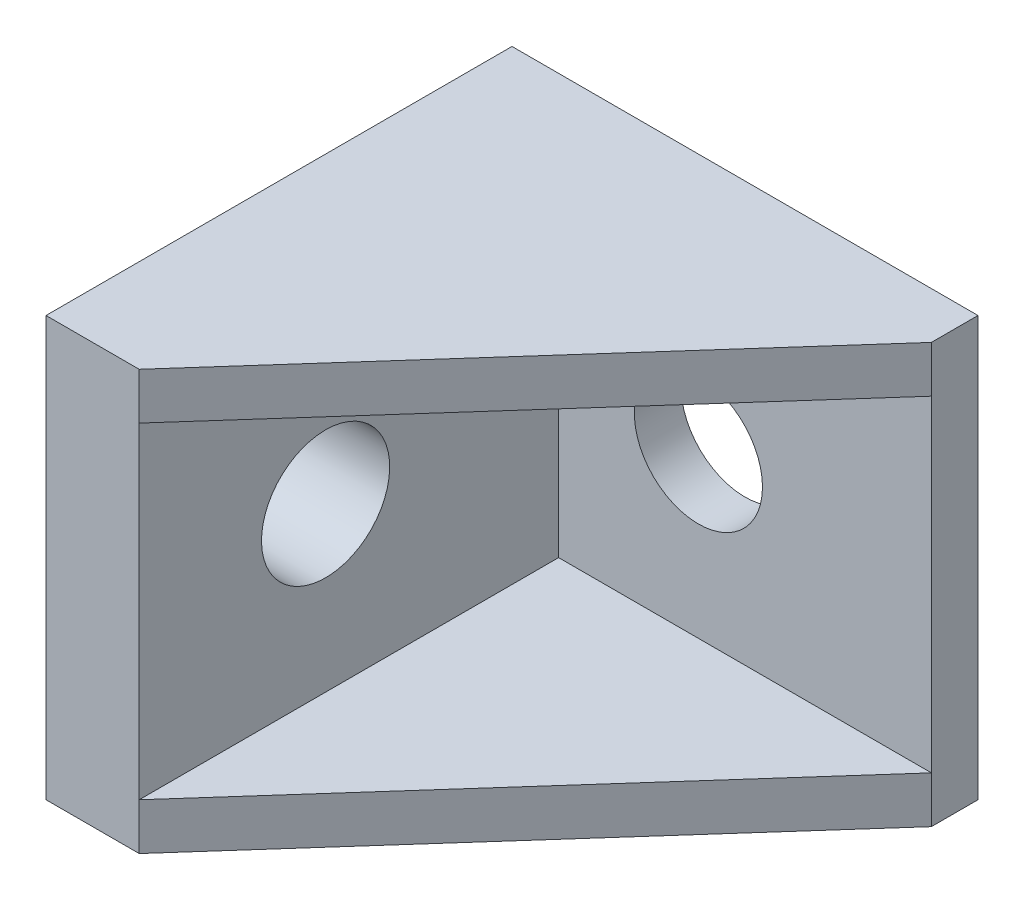
ISO-10303-21;
HEADER;
FILE_DESCRIPTION(('STEP AP214'),'2;1');
FILE_NAME('part.step','',(''),(''),'','','');
FILE_SCHEMA(('AUTOMOTIVE_DESIGN { 1 0 10303 214 1 1 1 1 }'));
ENDSEC;
DATA;
#1=APPLICATION_CONTEXT('core data for automotive mechanical design processes');
#2=APPLICATION_PROTOCOL_DEFINITION('international standard','automotive_design',2000,#1);
#3=PRODUCT_CONTEXT('',#1,'mechanical');
#4=PRODUCT('Part','Part','',(#3));
#5=PRODUCT_RELATED_PRODUCT_CATEGORY('part','',(#4));
#6=PRODUCT_DEFINITION_FORMATION('','',#4);
#7=PRODUCT_DEFINITION_CONTEXT('part definition',#1,'design');
#8=PRODUCT_DEFINITION('design','',#6,#7);
#9=PRODUCT_DEFINITION_SHAPE('','',#8);
#10=(LENGTH_UNIT() NAMED_UNIT(*) SI_UNIT(.MILLI.,.METRE.));
#11=(NAMED_UNIT(*) PLANE_ANGLE_UNIT() SI_UNIT($,.RADIAN.));
#12=(NAMED_UNIT(*) SI_UNIT($,.STERADIAN.) SOLID_ANGLE_UNIT());
#13=UNCERTAINTY_MEASURE_WITH_UNIT(LENGTH_MEASURE(1.E-05),#10,'distance_accuracy_value','');
#14=(GEOMETRIC_REPRESENTATION_CONTEXT(3) GLOBAL_UNCERTAINTY_ASSIGNED_CONTEXT((#13)) GLOBAL_UNIT_ASSIGNED_CONTEXT((#10,
#11,#12)) REPRESENTATION_CONTEXT('',''));
#15=CARTESIAN_POINT('',(0.,0.,0.));
#16=DIRECTION('',(0.,0.,1.));
#17=DIRECTION('',(1.,0.,0.));
#18=AXIS2_PLACEMENT_3D('',#15,#16,#17);
#19=CARTESIAN_POINT('',(10.,9.,20.));
#20=DIRECTION('',(-1.,0.,0.));
#21=DIRECTION('',(0.,0.,1.));
#22=AXIS2_PLACEMENT_3D('',#19,#20,#21);
#23=PLANE('',#22);
#24=DIRECTION('',(0.,0.,-1.));
#25=VECTOR('',#24,1.);
#26=CARTESIAN_POINT('',(10.,9.,20.));
#27=LINE('',#26,#25);
#28=CARTESIAN_POINT('',(10.,9.,2.));
#29=VERTEX_POINT('',#28);
#30=CARTESIAN_POINT('',(10.,9.,0.));
#31=VERTEX_POINT('',#30);
#32=EDGE_CURVE('E11',#29,#31,#27,.T.);
#33=ORIENTED_EDGE('',*,*,#32,.F.);
#34=DIRECTION('',(0.,1.,0.));
#35=VECTOR('',#34,1.);
#36=CARTESIAN_POINT('',(10.,-9.,2.));
#37=LINE('',#36,#35);
#38=CARTESIAN_POINT('',(10.,7.,2.));
#39=VERTEX_POINT('',#38);
#40=EDGE_CURVE('E138',#39,#29,#37,.T.);
#41=ORIENTED_EDGE('',*,*,#40,.F.);
#42=DIRECTION('',(0.,1.,0.));
#43=VECTOR('',#42,1.);
#44=CARTESIAN_POINT('',(10.,7.,2.));
#45=LINE('',#44,#43);
#46=CARTESIAN_POINT('',(10.,-7.,2.));
#47=VERTEX_POINT('',#46);
#48=EDGE_CURVE('E193',#47,#39,#45,.T.);
#49=ORIENTED_EDGE('',*,*,#48,.F.);
#50=CARTESIAN_POINT('',(10.,-9.,2.));
#51=VERTEX_POINT('',#50);
#52=EDGE_CURVE('E91',#51,#47,#37,.T.);
#53=ORIENTED_EDGE('',*,*,#52,.F.);
#54=DIRECTION('',(0.,0.,-1.));
#55=VECTOR('',#54,1.);
#56=CARTESIAN_POINT('',(10.,-9.,20.));
#57=LINE('',#56,#55);
#58=CARTESIAN_POINT('',(10.,-9.,0.));
#59=VERTEX_POINT('',#58);
#60=EDGE_CURVE('E83',#51,#59,#57,.T.);
#61=ORIENTED_EDGE('',*,*,#60,.T.);
#62=DIRECTION('',(0.,1.,0.));
#63=VECTOR('',#62,1.);
#64=CARTESIAN_POINT('',(10.,9.,0.));
#65=LINE('',#64,#63);
#66=EDGE_CURVE('E87',#59,#31,#65,.T.);
#67=ORIENTED_EDGE('',*,*,#66,.T.);
#68=EDGE_LOOP('',(#33,#41,#49,#53,#61,#67));
#69=FACE_BOUND('',#68,.T.);
#70=ADVANCED_FACE('F44',(#69),#23,.F.);
#71=CARTESIAN_POINT('',(-10.,9.,20.));
#72=DIRECTION('',(0.,-1.,0.));
#73=DIRECTION('',(0.,0.,-1.));
#74=AXIS2_PLACEMENT_3D('',#71,#72,#73);
#75=PLANE('',#74);
#76=DIRECTION('',(-1.,0.,0.));
#77=VECTOR('',#76,1.);
#78=CARTESIAN_POINT('',(-10.,9.,20.));
#79=LINE('',#78,#77);
#80=CARTESIAN_POINT('',(-6.,9.,20.));
#81=VERTEX_POINT('',#80);
#82=CARTESIAN_POINT('',(-10.,9.,20.));
#83=VERTEX_POINT('',#82);
#84=EDGE_CURVE('E104',#81,#83,#79,.T.);
#85=ORIENTED_EDGE('',*,*,#84,.F.);
#86=DIRECTION('',(-0.66436383882992,0.,0.74740931868366));
#87=VECTOR('',#86,1.);
#88=CARTESIAN_POINT('',(-6.,9.,20.));
#89=LINE('',#88,#87);
#90=EDGE_CURVE('E134',#29,#81,#89,.T.);
#91=ORIENTED_EDGE('',*,*,#90,.F.);
#92=ORIENTED_EDGE('',*,*,#32,.T.);
#93=DIRECTION('',(-1.,0.,0.));
#94=VECTOR('',#93,1.);
#95=CARTESIAN_POINT('',(-10.,9.,0.));
#96=LINE('',#95,#94);
#97=CARTESIAN_POINT('',(-10.,9.,0.));
#98=VERTEX_POINT('',#97);
#99=EDGE_CURVE('E108',#31,#98,#96,.T.);
#100=ORIENTED_EDGE('',*,*,#99,.T.);
#101=DIRECTION('',(0.,0.,-1.));
#102=VECTOR('',#101,1.);
#103=CARTESIAN_POINT('',(-10.,9.,20.));
#104=LINE('',#103,#102);
#105=EDGE_CURVE('E53',#83,#98,#104,.T.);
#106=ORIENTED_EDGE('',*,*,#105,.F.);
#107=EDGE_LOOP('',(#85,#91,#92,#100,#106));
#108=FACE_BOUND('',#107,.T.);
#109=ADVANCED_FACE('F129',(#108),#75,.F.);
#110=CARTESIAN_POINT('',(-10.,9.,20.));
#111=DIRECTION('',(1.,0.,0.));
#112=DIRECTION('',(0.,0.,-1.));
#113=AXIS2_PLACEMENT_3D('',#110,#111,#112);
#114=PLANE('',#113);
#115=CARTESIAN_POINT('',(-10.,0.,12.));
#116=DIRECTION('',(1.,0.,0.));
#117=DIRECTION('',(0.,1.,0.));
#118=AXIS2_PLACEMENT_3D('',#115,#116,#117);
#119=CIRCLE('',#118,2.75);
#120=CARTESIAN_POINT('',(-10.,2.75,12.));
#121=VERTEX_POINT('',#120);
#122=EDGE_CURVE('E272',#121,#121,#119,.T.);
#123=ORIENTED_EDGE('',*,*,#122,.T.);
#124=EDGE_LOOP('',(#123));
#125=FACE_BOUND('',#124,.T.);
#126=DIRECTION('',(0.,-1.,0.));
#127=VECTOR('',#126,1.);
#128=CARTESIAN_POINT('',(-10.,9.,0.));
#129=LINE('',#128,#127);
#130=CARTESIAN_POINT('',(-10.,-9.,0.));
#131=VERTEX_POINT('',#130);
#132=EDGE_CURVE('E76',#98,#131,#129,.T.);
#133=ORIENTED_EDGE('',*,*,#132,.T.);
#134=DIRECTION('',(0.,0.,-1.));
#135=VECTOR('',#134,1.);
#136=CARTESIAN_POINT('',(-10.,-9.,20.));
#137=LINE('',#136,#135);
#138=CARTESIAN_POINT('',(-10.,-9.,20.));
#139=VERTEX_POINT('',#138);
#140=EDGE_CURVE('E95',#139,#131,#137,.T.);
#141=ORIENTED_EDGE('',*,*,#140,.F.);
#142=DIRECTION('',(0.,-1.,0.));
#143=VECTOR('',#142,1.);
#144=CARTESIAN_POINT('',(-10.,9.,20.));
#145=LINE('',#144,#143);
#146=EDGE_CURVE('E61',#83,#139,#145,.T.);
#147=ORIENTED_EDGE('',*,*,#146,.F.);
#148=ORIENTED_EDGE('',*,*,#105,.T.);
#149=EDGE_LOOP('',(#133,#141,#147,#148));
#150=FACE_BOUND('',#149,.T.);
#151=ADVANCED_FACE('F126',(#125,#150),#114,.F.);
#152=CARTESIAN_POINT('',(-10.,-9.,20.));
#153=DIRECTION('',(0.,1.,0.));
#154=DIRECTION('',(0.,0.,1.));
#155=AXIS2_PLACEMENT_3D('',#152,#153,#154);
#156=PLANE('',#155);
#157=ORIENTED_EDGE('',*,*,#60,.F.);
#158=DIRECTION('',(-0.66436383882992,0.,0.74740931868366));
#159=VECTOR('',#158,1.);
#160=CARTESIAN_POINT('',(-6.,-9.,20.));
#161=LINE('',#160,#159);
#162=CARTESIAN_POINT('',(-6.,-9.,20.));
#163=VERTEX_POINT('',#162);
#164=EDGE_CURVE('E206',#51,#163,#161,.T.);
#165=ORIENTED_EDGE('',*,*,#164,.T.);
#166=DIRECTION('',(1.,0.,0.));
#167=VECTOR('',#166,1.);
#168=CARTESIAN_POINT('',(-10.,-9.,20.));
#169=LINE('',#168,#167);
#170=EDGE_CURVE('E96',#139,#163,#169,.T.);
#171=ORIENTED_EDGE('',*,*,#170,.F.);
#172=ORIENTED_EDGE('',*,*,#140,.T.);
#173=DIRECTION('',(1.,0.,0.));
#174=VECTOR('',#173,1.);
#175=CARTESIAN_POINT('',(-10.,-9.,0.));
#176=LINE('',#175,#174);
#177=EDGE_CURVE('E99',#131,#59,#176,.T.);
#178=ORIENTED_EDGE('',*,*,#177,.T.);
#179=EDGE_LOOP('',(#157,#165,#171,#172,#178));
#180=FACE_BOUND('',#179,.T.);
#181=ADVANCED_FACE('F100',(#180),#156,.F.);
#182=CARTESIAN_POINT('',(0.,0.,20.));
#183=DIRECTION('',(0.,0.,1.));
#184=DIRECTION('',(1.,0.,0.));
#185=AXIS2_PLACEMENT_3D('',#182,#183,#184);
#186=PLANE('',#185);
#187=DIRECTION('',(0.,1.,0.));
#188=VECTOR('',#187,1.);
#189=CARTESIAN_POINT('',(-6.,-9.,20.));
#190=LINE('',#189,#188);
#191=CARTESIAN_POINT('',(-6.,7.,20.));
#192=VERTEX_POINT('',#191);
#193=EDGE_CURVE('E163',#192,#81,#190,.T.);
#194=ORIENTED_EDGE('',*,*,#193,.T.);
#195=ORIENTED_EDGE('',*,*,#84,.T.);
#196=ORIENTED_EDGE('',*,*,#146,.T.);
#197=ORIENTED_EDGE('',*,*,#170,.T.);
#198=CARTESIAN_POINT('',(-6.,-7.,20.));
#199=VERTEX_POINT('',#198);
#200=EDGE_CURVE('E169',#163,#199,#190,.T.);
#201=ORIENTED_EDGE('',*,*,#200,.T.);
#202=DIRECTION('',(0.,-1.,0.));
#203=VECTOR('',#202,1.);
#204=CARTESIAN_POINT('',(-6.,7.,20.));
#205=LINE('',#204,#203);
#206=EDGE_CURVE('E184',#192,#199,#205,.T.);
#207=ORIENTED_EDGE('',*,*,#206,.F.);
#208=EDGE_LOOP('',(#194,#195,#196,#197,#201,#207));
#209=FACE_BOUND('',#208,.T.);
#210=ADVANCED_FACE('F191',(#209),#186,.T.);
#211=CARTESIAN_POINT('',(0.,0.,0.));
#212=DIRECTION('',(0.,0.,1.));
#213=DIRECTION('',(1.,0.,0.));
#214=AXIS2_PLACEMENT_3D('',#211,#212,#213);
#215=PLANE('',#214);
#216=CARTESIAN_POINT('',(0.,0.,0.));
#217=DIRECTION('',(0.,0.,1.));
#218=DIRECTION('',(1.,0.,0.));
#219=AXIS2_PLACEMENT_3D('',#216,#217,#218);
#220=CIRCLE('',#219,2.75);
#221=CARTESIAN_POINT('',(2.75,0.,0.));
#222=VERTEX_POINT('',#221);
#223=EDGE_CURVE('E213',#222,#222,#220,.T.);
#224=ORIENTED_EDGE('',*,*,#223,.T.);
#225=EDGE_LOOP('',(#224));
#226=FACE_BOUND('',#225,.T.);
#227=ORIENTED_EDGE('',*,*,#66,.F.);
#228=ORIENTED_EDGE('',*,*,#177,.F.);
#229=ORIENTED_EDGE('',*,*,#132,.F.);
#230=ORIENTED_EDGE('',*,*,#99,.F.);
#231=EDGE_LOOP('',(#227,#228,#229,#230));
#232=FACE_BOUND('',#231,.T.);
#233=ADVANCED_FACE('F107',(#226,#232),#215,.F.);
#234=CARTESIAN_POINT('',(10.,-7.,2.));
#235=DIRECTION('',(0.,-1.,0.));
#236=DIRECTION('',(1.,0.,0.));
#237=AXIS2_PLACEMENT_3D('',#234,#235,#236);
#238=PLANE('',#237);
#239=DIRECTION('',(0.,0.,1.));
#240=VECTOR('',#239,1.);
#241=CARTESIAN_POINT('',(-6.,-7.,2.));
#242=LINE('',#241,#240);
#243=CARTESIAN_POINT('',(-6.,-7.,2.));
#244=VERTEX_POINT('',#243);
#245=EDGE_CURVE('E110',#244,#199,#242,.T.);
#246=ORIENTED_EDGE('',*,*,#245,.T.);
#247=DIRECTION('',(0.66436383882992,0.,-0.74740931868366));
#248=VECTOR('',#247,1.);
#249=CARTESIAN_POINT('',(10.,-7.,2.));
#250=LINE('',#249,#248);
#251=EDGE_CURVE('E179',#199,#47,#250,.T.);
#252=ORIENTED_EDGE('',*,*,#251,.T.);
#253=DIRECTION('',(1.,0.,0.));
#254=VECTOR('',#253,1.);
#255=CARTESIAN_POINT('',(10.,-7.,2.));
#256=LINE('',#255,#254);
#257=EDGE_CURVE('E188',#244,#47,#256,.T.);
#258=ORIENTED_EDGE('',*,*,#257,.F.);
#259=EDGE_LOOP('',(#246,#252,#258));
#260=FACE_BOUND('',#259,.T.);
#261=ADVANCED_FACE('F227',(#260),#238,.F.);
#262=CARTESIAN_POINT('',(-6.,7.,2.));
#263=DIRECTION('',(-1.,0.,0.));
#264=DIRECTION('',(0.,-1.,0.));
#265=AXIS2_PLACEMENT_3D('',#262,#263,#264);
#266=PLANE('',#265);
#267=CARTESIAN_POINT('',(-6.,0.,12.));
#268=DIRECTION('',(1.,0.,0.));
#269=DIRECTION('',(0.,1.,0.));
#270=AXIS2_PLACEMENT_3D('',#267,#268,#269);
#271=CIRCLE('',#270,2.75);
#272=CARTESIAN_POINT('',(-6.,2.75,12.));
#273=VERTEX_POINT('',#272);
#274=EDGE_CURVE('E278',#273,#273,#271,.T.);
#275=ORIENTED_EDGE('',*,*,#274,.F.);
#276=EDGE_LOOP('',(#275));
#277=FACE_BOUND('',#276,.T.);
#278=ORIENTED_EDGE('',*,*,#206,.T.);
#279=ORIENTED_EDGE('',*,*,#245,.F.);
#280=DIRECTION('',(0.,-1.,0.));
#281=VECTOR('',#280,1.);
#282=CARTESIAN_POINT('',(-6.,7.,2.));
#283=LINE('',#282,#281);
#284=CARTESIAN_POINT('',(-6.,7.,2.));
#285=VERTEX_POINT('',#284);
#286=EDGE_CURVE('E186',#285,#244,#283,.T.);
#287=ORIENTED_EDGE('',*,*,#286,.F.);
#288=DIRECTION('',(0.,0.,1.));
#289=VECTOR('',#288,1.);
#290=CARTESIAN_POINT('',(-6.,7.,2.));
#291=LINE('',#290,#289);
#292=EDGE_CURVE('E116',#285,#192,#291,.T.);
#293=ORIENTED_EDGE('',*,*,#292,.T.);
#294=EDGE_LOOP('',(#278,#279,#287,#293));
#295=FACE_BOUND('',#294,.T.);
#296=ADVANCED_FACE('F183',(#277,#295),#266,.F.);
#297=CARTESIAN_POINT('',(10.,7.,2.));
#298=DIRECTION('',(0.,1.,0.));
#299=DIRECTION('',(-1.,0.,0.));
#300=AXIS2_PLACEMENT_3D('',#297,#298,#299);
#301=PLANE('',#300);
#302=DIRECTION('',(-1.,0.,0.));
#303=VECTOR('',#302,1.);
#304=CARTESIAN_POINT('',(10.,7.,2.));
#305=LINE('',#304,#303);
#306=EDGE_CURVE('E176',#39,#285,#305,.T.);
#307=ORIENTED_EDGE('',*,*,#306,.F.);
#308=DIRECTION('',(-0.66436383882992,0.,0.74740931868366));
#309=VECTOR('',#308,1.);
#310=CARTESIAN_POINT('',(10.,7.,2.));
#311=LINE('',#310,#309);
#312=EDGE_CURVE('E166',#39,#192,#311,.T.);
#313=ORIENTED_EDGE('',*,*,#312,.T.);
#314=ORIENTED_EDGE('',*,*,#292,.F.);
#315=EDGE_LOOP('',(#307,#313,#314));
#316=FACE_BOUND('',#315,.T.);
#317=ADVANCED_FACE('F173',(#316),#301,.F.);
#318=CARTESIAN_POINT('',(0.,0.,2.));
#319=DIRECTION('',(0.,0.,-1.));
#320=DIRECTION('',(-1.,0.,0.));
#321=AXIS2_PLACEMENT_3D('',#318,#319,#320);
#322=PLANE('',#321);
#323=CARTESIAN_POINT('',(0.,0.,2.));
#324=DIRECTION('',(0.,0.,1.));
#325=DIRECTION('',(1.,0.,0.));
#326=AXIS2_PLACEMENT_3D('',#323,#324,#325);
#327=CIRCLE('',#326,2.75);
#328=CARTESIAN_POINT('',(2.75,0.,2.));
#329=VERTEX_POINT('',#328);
#330=EDGE_CURVE('E269',#329,#329,#327,.T.);
#331=ORIENTED_EDGE('',*,*,#330,.F.);
#332=EDGE_LOOP('',(#331));
#333=FACE_BOUND('',#332,.T.);
#334=ORIENTED_EDGE('',*,*,#48,.T.);
#335=ORIENTED_EDGE('',*,*,#306,.T.);
#336=ORIENTED_EDGE('',*,*,#286,.T.);
#337=ORIENTED_EDGE('',*,*,#257,.T.);
#338=EDGE_LOOP('',(#334,#335,#336,#337));
#339=FACE_BOUND('',#338,.T.);
#340=ADVANCED_FACE('F225',(#333,#339),#322,.F.);
#341=CARTESIAN_POINT('',(-6.,-9.,20.));
#342=DIRECTION('',(-0.74740931868366,0.,-0.66436383882992));
#343=DIRECTION('',(-0.66436383882992,0.,0.74740931868366));
#344=AXIS2_PLACEMENT_3D('',#341,#342,#343);
#345=PLANE('',#344);
#346=ORIENTED_EDGE('',*,*,#40,.T.);
#347=ORIENTED_EDGE('',*,*,#90,.T.);
#348=ORIENTED_EDGE('',*,*,#193,.F.);
#349=ORIENTED_EDGE('',*,*,#312,.F.);
#350=EDGE_LOOP('',(#346,#347,#348,#349));
#351=FACE_BOUND('',#350,.T.);
#352=ADVANCED_FACE('F165',(#351),#345,.F.);
#353=ORIENTED_EDGE('',*,*,#200,.F.);
#354=ORIENTED_EDGE('',*,*,#164,.F.);
#355=ORIENTED_EDGE('',*,*,#52,.T.);
#356=ORIENTED_EDGE('',*,*,#251,.F.);
#357=EDGE_LOOP('',(#353,#354,#355,#356));
#358=FACE_BOUND('',#357,.T.);
#359=ADVANCED_FACE('F228',(#358),#345,.F.);
#360=CARTESIAN_POINT('',(0.,0.,0.));
#361=DIRECTION('',(0.,0.,1.));
#362=DIRECTION('',(1.,0.,0.));
#363=AXIS2_PLACEMENT_3D('',#360,#361,#362);
#364=CYLINDRICAL_SURFACE('',#363,2.75);
#365=ORIENTED_EDGE('',*,*,#223,.F.);
#366=EDGE_LOOP('',(#365));
#367=FACE_BOUND('',#366,.T.);
#368=ORIENTED_EDGE('',*,*,#330,.T.);
#369=EDGE_LOOP('',(#368));
#370=FACE_BOUND('',#369,.T.);
#371=ADVANCED_FACE('F230',(#367,#370),#364,.F.);
#372=CARTESIAN_POINT('',(-10.,0.,12.));
#373=DIRECTION('',(1.,0.,0.));
#374=DIRECTION('',(0.,1.,0.));
#375=AXIS2_PLACEMENT_3D('',#372,#373,#374);
#376=CYLINDRICAL_SURFACE('',#375,2.75);
#377=ORIENTED_EDGE('',*,*,#122,.F.);
#378=EDGE_LOOP('',(#377));
#379=FACE_BOUND('',#378,.T.);
#380=ORIENTED_EDGE('',*,*,#274,.T.);
#381=EDGE_LOOP('',(#380));
#382=FACE_BOUND('',#381,.T.);
#383=ADVANCED_FACE('F236',(#379,#382),#376,.F.);
#384=CLOSED_SHELL('',(#70,#109,#151,#181,#210,#233,#261,#296,#317,#340,#352,#359,#371,#383));
#385=MANIFOLD_SOLID_BREP('B2',#384);
#386=ADVANCED_BREP_SHAPE_REPRESENTATION('',(#18,#385),#14);
#387=SHAPE_DEFINITION_REPRESENTATION(#9,#386);
ENDSEC;
END-ISO-10303-21;
